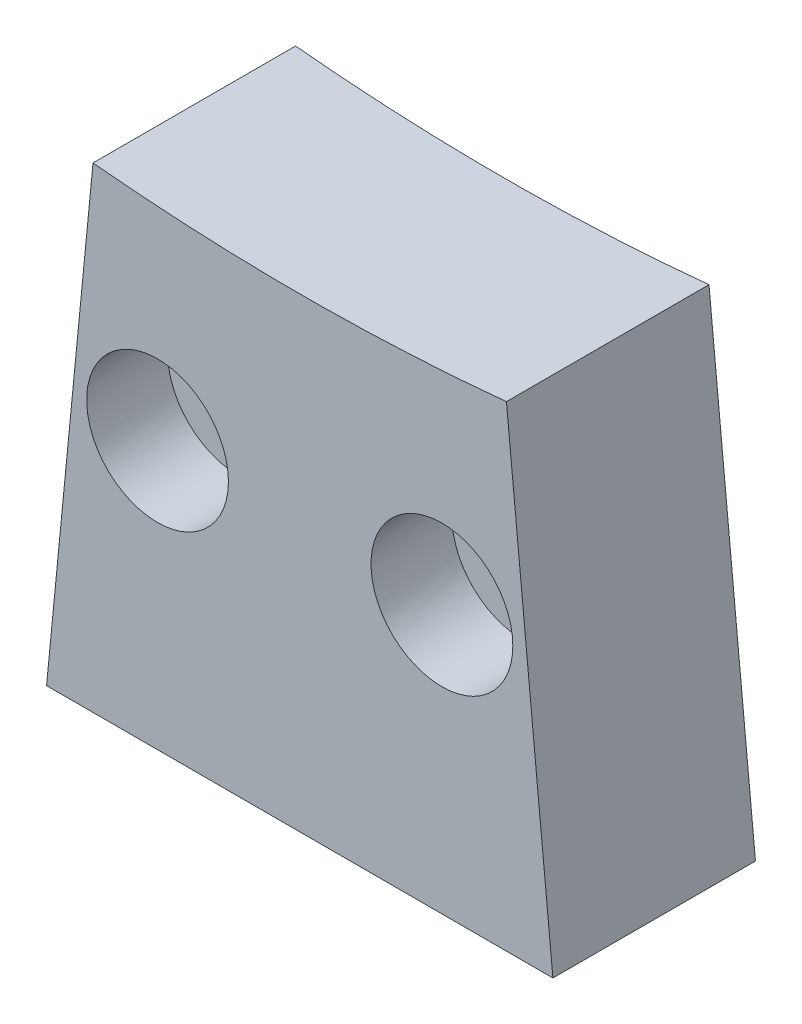
ISO-10303-21;
HEADER;
FILE_DESCRIPTION(('STEP AP214'),'2;1');
FILE_NAME('part.step','',(''),(''),'','','');
FILE_SCHEMA(('AUTOMOTIVE_DESIGN { 1 0 10303 214 1 1 1 1 }'));
ENDSEC;
DATA;
#1=APPLICATION_CONTEXT('core data for automotive mechanical design processes');
#2=APPLICATION_PROTOCOL_DEFINITION('international standard','automotive_design',2000,#1);
#3=PRODUCT_CONTEXT('',#1,'mechanical');
#4=PRODUCT('Part','Part','',(#3));
#5=PRODUCT_RELATED_PRODUCT_CATEGORY('part','',(#4));
#6=PRODUCT_DEFINITION_FORMATION('','',#4);
#7=PRODUCT_DEFINITION_CONTEXT('part definition',#1,'design');
#8=PRODUCT_DEFINITION('design','',#6,#7);
#9=PRODUCT_DEFINITION_SHAPE('','',#8);
#10=(LENGTH_UNIT() NAMED_UNIT(*) SI_UNIT(.MILLI.,.METRE.));
#11=(NAMED_UNIT(*) PLANE_ANGLE_UNIT() SI_UNIT($,.RADIAN.));
#12=(NAMED_UNIT(*) SI_UNIT($,.STERADIAN.) SOLID_ANGLE_UNIT());
#13=UNCERTAINTY_MEASURE_WITH_UNIT(LENGTH_MEASURE(1.E-05),#10,'distance_accuracy_value','');
#14=(GEOMETRIC_REPRESENTATION_CONTEXT(3) GLOBAL_UNCERTAINTY_ASSIGNED_CONTEXT((#13)) GLOBAL_UNIT_ASSIGNED_CONTEXT((#10,
#11,#12)) REPRESENTATION_CONTEXT('',''));
#15=CARTESIAN_POINT('',(0.,0.,0.));
#16=DIRECTION('',(0.,0.,1.));
#17=DIRECTION('',(1.,0.,0.));
#18=AXIS2_PLACEMENT_3D('',#15,#16,#17);
#19=CARTESIAN_POINT('',(7.02058204650813,-114.785501818515,-0.000999999999999265));
#20=DIRECTION('',(0.,0.,1.));
#21=DIRECTION('',(1.,0.,0.));
#22=AXIS2_PLACEMENT_3D('',#19,#20,#21);
#23=CYLINDRICAL_SURFACE('',#22,1.75);
#24=CARTESIAN_POINT('',(7.02058204650813,-114.785501818515,0.));
#25=DIRECTION('',(0.,0.,-1.));
#26=DIRECTION('',(-1.,0.,0.));
#27=AXIS2_PLACEMENT_3D('',#24,#25,#26);
#28=CIRCLE('',#27,1.75);
#29=CARTESIAN_POINT('',(5.27058204650813,-114.785501818515,0.));
#30=VERTEX_POINT('',#29);
#31=EDGE_CURVE('E147',#30,#30,#28,.F.);
#32=ORIENTED_EDGE('',*,*,#31,.F.);
#33=EDGE_LOOP('',(#32));
#34=FACE_BOUND('',#33,.T.);
#35=CARTESIAN_POINT('',(7.02058204650813,-114.785501818515,6.));
#36=DIRECTION('',(0.,0.,1.));
#37=DIRECTION('',(1.,0.,0.));
#38=AXIS2_PLACEMENT_3D('',#35,#36,#37);
#39=CIRCLE('',#38,1.75);
#40=CARTESIAN_POINT('',(8.77058204650814,-114.785501818515,6.));
#41=VERTEX_POINT('',#40);
#42=EDGE_CURVE('E166',#41,#41,#39,.F.);
#43=ORIENTED_EDGE('',*,*,#42,.F.);
#44=EDGE_LOOP('',(#43));
#45=FACE_BOUND('',#44,.T.);
#46=ADVANCED_FACE('F39',(#34,#45),#23,.F.);
#47=CARTESIAN_POINT('',(-7.02058204650813,-114.785501818515,-0.000999999999999265));
#48=DIRECTION('',(0.,0.,1.));
#49=DIRECTION('',(1.,0.,0.));
#50=AXIS2_PLACEMENT_3D('',#47,#48,#49);
#51=CYLINDRICAL_SURFACE('',#50,1.75);
#52=CARTESIAN_POINT('',(-7.02058204650813,-114.785501818515,0.));
#53=DIRECTION('',(0.,0.,-1.));
#54=DIRECTION('',(-1.,0.,0.));
#55=AXIS2_PLACEMENT_3D('',#52,#53,#54);
#56=CIRCLE('',#55,1.75);
#57=CARTESIAN_POINT('',(-8.77058204650813,-114.785501818515,0.));
#58=VERTEX_POINT('',#57);
#59=EDGE_CURVE('E136',#58,#58,#56,.F.);
#60=ORIENTED_EDGE('',*,*,#59,.F.);
#61=EDGE_LOOP('',(#60));
#62=FACE_BOUND('',#61,.T.);
#63=CARTESIAN_POINT('',(-7.02058204650813,-114.785501818515,6.));
#64=DIRECTION('',(0.,0.,1.));
#65=DIRECTION('',(1.,0.,0.));
#66=AXIS2_PLACEMENT_3D('',#63,#64,#65);
#67=CIRCLE('',#66,1.75);
#68=CARTESIAN_POINT('',(-5.27058204650813,-114.785501818515,6.));
#69=VERTEX_POINT('',#68);
#70=EDGE_CURVE('E43',#69,#69,#67,.F.);
#71=ORIENTED_EDGE('',*,*,#70,.F.);
#72=EDGE_LOOP('',(#71));
#73=FACE_BOUND('',#72,.T.);
#74=ADVANCED_FACE('F179',(#62,#73),#51,.F.);
#75=CARTESIAN_POINT('',(0.,0.,10.));
#76=DIRECTION('',(0.,0.,-1.));
#77=DIRECTION('',(-1.,0.,0.));
#78=AXIS2_PLACEMENT_3D('',#75,#76,#77);
#79=CYLINDRICAL_SURFACE('',#78,105.);
#80=CARTESIAN_POINT('',(0.,0.,0.));
#81=DIRECTION('',(0.,0.,-1.));
#82=DIRECTION('',(-1.,0.,0.));
#83=AXIS2_PLACEMENT_3D('',#80,#81,#82);
#84=CIRCLE('',#83,105.);
#85=CARTESIAN_POINT('',(10.2053587787538,-104.502873894438,0.));
#86=VERTEX_POINT('',#85);
#87=CARTESIAN_POINT('',(-10.2053587787537,-104.502873894438,0.));
#88=VERTEX_POINT('',#87);
#89=EDGE_CURVE('E110',#86,#88,#84,.T.);
#90=ORIENTED_EDGE('',*,*,#89,.T.);
#91=DIRECTION('',(0.,0.,-1.));
#92=VECTOR('',#91,1.);
#93=CARTESIAN_POINT('',(-10.2053587787537,-104.502873894438,10.));
#94=LINE('',#93,#92);
#95=CARTESIAN_POINT('',(-10.2053587787537,-104.502873894438,10.));
#96=VERTEX_POINT('',#95);
#97=EDGE_CURVE('E11',#96,#88,#94,.T.);
#98=ORIENTED_EDGE('',*,*,#97,.F.);
#99=CARTESIAN_POINT('',(0.,0.,10.));
#100=DIRECTION('',(0.,0.,-1.));
#101=DIRECTION('',(-1.,0.,0.));
#102=AXIS2_PLACEMENT_3D('',#99,#100,#101);
#103=CIRCLE('',#102,105.);
#104=CARTESIAN_POINT('',(10.2053587787538,-104.502873894438,10.));
#105=VERTEX_POINT('',#104);
#106=EDGE_CURVE('E93',#105,#96,#103,.T.);
#107=ORIENTED_EDGE('',*,*,#106,.F.);
#108=DIRECTION('',(0.,0.,-1.));
#109=VECTOR('',#108,1.);
#110=CARTESIAN_POINT('',(10.2053587787538,-104.502873894438,10.));
#111=LINE('',#110,#109);
#112=EDGE_CURVE('E106',#105,#86,#111,.T.);
#113=ORIENTED_EDGE('',*,*,#112,.T.);
#114=EDGE_LOOP('',(#90,#98,#107,#113));
#115=FACE_BOUND('',#114,.T.);
#116=ADVANCED_FACE('F41',(#115),#79,.F.);
#117=CARTESIAN_POINT('',(-10.2053587787537,-104.502873894438,10.));
#118=DIRECTION('',(0.995265465661319,-0.0971938931309879,0.));
#119=DIRECTION('',(0.0971938931309879,0.995265465661319,0.));
#120=AXIS2_PLACEMENT_3D('',#117,#118,#119);
#121=PLANE('',#120);
#122=DIRECTION('',(-0.0971938931309879,-0.995265465661319,0.));
#123=VECTOR('',#122,1.);
#124=CARTESIAN_POINT('',(-10.2053587787537,-104.502873894438,0.));
#125=LINE('',#124,#123);
#126=CARTESIAN_POINT('',(-12.5,-128.,0.));
#127=VERTEX_POINT('',#126);
#128=EDGE_CURVE('E98',#88,#127,#125,.T.);
#129=ORIENTED_EDGE('',*,*,#128,.T.);
#130=DIRECTION('',(0.,0.,-1.));
#131=VECTOR('',#130,1.);
#132=CARTESIAN_POINT('',(-12.5,-128.,10.));
#133=LINE('',#132,#131);
#134=CARTESIAN_POINT('',(-12.5,-128.,10.));
#135=VERTEX_POINT('',#134);
#136=EDGE_CURVE('E50',#135,#127,#133,.T.);
#137=ORIENTED_EDGE('',*,*,#136,.F.);
#138=DIRECTION('',(-0.0971938931309879,-0.995265465661319,0.));
#139=VECTOR('',#138,1.);
#140=CARTESIAN_POINT('',(-10.2053587787537,-104.502873894438,10.));
#141=LINE('',#140,#139);
#142=EDGE_CURVE('E88',#96,#135,#141,.T.);
#143=ORIENTED_EDGE('',*,*,#142,.F.);
#144=ORIENTED_EDGE('',*,*,#97,.T.);
#145=EDGE_LOOP('',(#129,#137,#143,#144));
#146=FACE_BOUND('',#145,.T.);
#147=ADVANCED_FACE('F97',(#146),#121,.F.);
#148=CARTESIAN_POINT('',(-12.5,-128.,10.));
#149=DIRECTION('',(0.,1.,0.));
#150=DIRECTION('',(0.,0.,1.));
#151=AXIS2_PLACEMENT_3D('',#148,#149,#150);
#152=PLANE('',#151);
#153=CARTESIAN_POINT('',(-4.75,-128.,6.));
#154=DIRECTION('',(0.,-1.,0.));
#155=DIRECTION('',(1.,0.,0.));
#156=AXIS2_PLACEMENT_3D('',#153,#154,#155);
#157=CIRCLE('',#156,1.025);
#158=CARTESIAN_POINT('',(-3.725,-128.,6.));
#159=VERTEX_POINT('',#158);
#160=EDGE_CURVE('E140',#159,#159,#157,.T.);
#161=ORIENTED_EDGE('',*,*,#160,.F.);
#162=EDGE_LOOP('',(#161));
#163=FACE_BOUND('',#162,.T.);
#164=CARTESIAN_POINT('',(4.75,-128.,6.));
#165=DIRECTION('',(0.,-1.,0.));
#166=DIRECTION('',(1.,0.,0.));
#167=AXIS2_PLACEMENT_3D('',#164,#165,#166);
#168=CIRCLE('',#167,1.025);
#169=CARTESIAN_POINT('',(5.775,-128.,6.));
#170=VERTEX_POINT('',#169);
#171=EDGE_CURVE('E131',#170,#170,#168,.T.);
#172=ORIENTED_EDGE('',*,*,#171,.F.);
#173=EDGE_LOOP('',(#172));
#174=FACE_BOUND('',#173,.T.);
#175=DIRECTION('',(1.,0.,0.));
#176=VECTOR('',#175,1.);
#177=CARTESIAN_POINT('',(-12.5,-128.,0.));
#178=LINE('',#177,#176);
#179=CARTESIAN_POINT('',(12.5,-128.,0.));
#180=VERTEX_POINT('',#179);
#181=EDGE_CURVE('E75',#127,#180,#178,.T.);
#182=ORIENTED_EDGE('',*,*,#181,.T.);
#183=DIRECTION('',(0.,0.,-1.));
#184=VECTOR('',#183,1.);
#185=CARTESIAN_POINT('',(12.5,-128.,10.));
#186=LINE('',#185,#184);
#187=CARTESIAN_POINT('',(12.5,-128.,10.));
#188=VERTEX_POINT('',#187);
#189=EDGE_CURVE('E100',#188,#180,#186,.T.);
#190=ORIENTED_EDGE('',*,*,#189,.F.);
#191=DIRECTION('',(1.,0.,0.));
#192=VECTOR('',#191,1.);
#193=CARTESIAN_POINT('',(-12.5,-128.,10.));
#194=LINE('',#193,#192);
#195=EDGE_CURVE('E91',#135,#188,#194,.T.);
#196=ORIENTED_EDGE('',*,*,#195,.F.);
#197=ORIENTED_EDGE('',*,*,#136,.T.);
#198=EDGE_LOOP('',(#182,#190,#196,#197));
#199=FACE_BOUND('',#198,.T.);
#200=ADVANCED_FACE('F102',(#163,#174,#199),#152,.F.);
#201=CARTESIAN_POINT('',(10.2053587787538,-104.502873894438,10.));
#202=DIRECTION('',(-0.995265465661319,-0.0971938931309882,0.));
#203=DIRECTION('',(0.0971938931309882,-0.995265465661319,0.));
#204=AXIS2_PLACEMENT_3D('',#201,#202,#203);
#205=PLANE('',#204);
#206=DIRECTION('',(-0.0971938931309882,0.995265465661319,0.));
#207=VECTOR('',#206,1.);
#208=CARTESIAN_POINT('',(10.2053587787538,-104.502873894438,0.));
#209=LINE('',#208,#207);
#210=EDGE_CURVE('E81',#180,#86,#209,.T.);
#211=ORIENTED_EDGE('',*,*,#210,.T.);
#212=ORIENTED_EDGE('',*,*,#112,.F.);
#213=DIRECTION('',(-0.0971938931309882,0.995265465661319,0.));
#214=VECTOR('',#213,1.);
#215=CARTESIAN_POINT('',(10.2053587787538,-104.502873894438,10.));
#216=LINE('',#215,#214);
#217=EDGE_CURVE('E58',#188,#105,#216,.T.);
#218=ORIENTED_EDGE('',*,*,#217,.F.);
#219=ORIENTED_EDGE('',*,*,#189,.T.);
#220=EDGE_LOOP('',(#211,#212,#218,#219));
#221=FACE_BOUND('',#220,.T.);
#222=ADVANCED_FACE('F124',(#221),#205,.F.);
#223=CARTESIAN_POINT('',(0.,0.,10.));
#224=DIRECTION('',(0.,0.,-1.));
#225=DIRECTION('',(-1.,0.,0.));
#226=AXIS2_PLACEMENT_3D('',#223,#224,#225);
#227=PLANE('',#226);
#228=CARTESIAN_POINT('',(7.02058204650813,-114.785501818515,10.));
#229=DIRECTION('',(0.,0.,1.));
#230=DIRECTION('',(1.,0.,0.));
#231=AXIS2_PLACEMENT_3D('',#228,#229,#230);
#232=CIRCLE('',#231,3.5);
#233=CARTESIAN_POINT('',(10.5205820465081,-114.785501818515,10.));
#234=VERTEX_POINT('',#233);
#235=EDGE_CURVE('E162',#234,#234,#232,.T.);
#236=ORIENTED_EDGE('',*,*,#235,.F.);
#237=EDGE_LOOP('',(#236));
#238=FACE_BOUND('',#237,.T.);
#239=CARTESIAN_POINT('',(-7.02058204650813,-114.785501818515,10.));
#240=DIRECTION('',(0.,0.,1.));
#241=DIRECTION('',(1.,0.,0.));
#242=AXIS2_PLACEMENT_3D('',#239,#240,#241);
#243=CIRCLE('',#242,3.5);
#244=CARTESIAN_POINT('',(-3.52058204650813,-114.785501818515,10.));
#245=VERTEX_POINT('',#244);
#246=EDGE_CURVE('E158',#245,#245,#243,.T.);
#247=ORIENTED_EDGE('',*,*,#246,.F.);
#248=EDGE_LOOP('',(#247));
#249=FACE_BOUND('',#248,.T.);
#250=ORIENTED_EDGE('',*,*,#106,.T.);
#251=ORIENTED_EDGE('',*,*,#142,.T.);
#252=ORIENTED_EDGE('',*,*,#195,.T.);
#253=ORIENTED_EDGE('',*,*,#217,.T.);
#254=EDGE_LOOP('',(#250,#251,#252,#253));
#255=FACE_BOUND('',#254,.T.);
#256=ADVANCED_FACE('F89',(#238,#249,#255),#227,.F.);
#257=CARTESIAN_POINT('',(0.,0.,0.));
#258=DIRECTION('',(0.,0.,-1.));
#259=DIRECTION('',(-1.,0.,0.));
#260=AXIS2_PLACEMENT_3D('',#257,#258,#259);
#261=PLANE('',#260);
#262=ORIENTED_EDGE('',*,*,#59,.T.);
#263=EDGE_LOOP('',(#262));
#264=FACE_BOUND('',#263,.T.);
#265=ORIENTED_EDGE('',*,*,#31,.T.);
#266=EDGE_LOOP('',(#265));
#267=FACE_BOUND('',#266,.T.);
#268=ORIENTED_EDGE('',*,*,#89,.F.);
#269=ORIENTED_EDGE('',*,*,#210,.F.);
#270=ORIENTED_EDGE('',*,*,#181,.F.);
#271=ORIENTED_EDGE('',*,*,#128,.F.);
#272=EDGE_LOOP('',(#268,#269,#270,#271));
#273=FACE_BOUND('',#272,.T.);
#274=ADVANCED_FACE('F127',(#264,#267,#273),#261,.T.);
#275=CARTESIAN_POINT('',(4.75,-120.,6.));
#276=DIRECTION('',(0.,-1.,0.));
#277=DIRECTION('',(1.,0.,0.));
#278=AXIS2_PLACEMENT_3D('',#275,#276,#277);
#279=CYLINDRICAL_SURFACE('',#278,1.025);
#280=CARTESIAN_POINT('',(4.75,-120.,6.));
#281=DIRECTION('',(0.,-1.,0.));
#282=DIRECTION('',(1.,0.,0.));
#283=AXIS2_PLACEMENT_3D('',#280,#281,#282);
#284=CIRCLE('',#283,1.025);
#285=CARTESIAN_POINT('',(5.775,-120.,6.));
#286=VERTEX_POINT('',#285);
#287=EDGE_CURVE('E135',#286,#286,#284,.T.);
#288=ORIENTED_EDGE('',*,*,#287,.F.);
#289=EDGE_LOOP('',(#288));
#290=FACE_BOUND('',#289,.T.);
#291=ORIENTED_EDGE('',*,*,#171,.T.);
#292=EDGE_LOOP('',(#291));
#293=FACE_BOUND('',#292,.T.);
#294=ADVANCED_FACE('F202',(#290,#293),#279,.F.);
#295=CARTESIAN_POINT('',(4.75,-120.,6.));
#296=DIRECTION('',(0.,-1.,0.));
#297=DIRECTION('',(1.,0.,0.));
#298=AXIS2_PLACEMENT_3D('',#295,#296,#297);
#299=PLANE('',#298);
#300=ORIENTED_EDGE('',*,*,#287,.T.);
#301=EDGE_LOOP('',(#300));
#302=FACE_BOUND('',#301,.T.);
#303=ADVANCED_FACE('F198',(#302),#299,.T.);
#304=CARTESIAN_POINT('',(-4.75,-120.,6.));
#305=DIRECTION('',(0.,-1.,0.));
#306=DIRECTION('',(1.,0.,0.));
#307=AXIS2_PLACEMENT_3D('',#304,#305,#306);
#308=CYLINDRICAL_SURFACE('',#307,1.025);
#309=CARTESIAN_POINT('',(-4.75,-120.,6.));
#310=DIRECTION('',(0.,-1.,0.));
#311=DIRECTION('',(1.,0.,0.));
#312=AXIS2_PLACEMENT_3D('',#309,#310,#311);
#313=CIRCLE('',#312,1.025);
#314=CARTESIAN_POINT('',(-3.725,-120.,6.));
#315=VERTEX_POINT('',#314);
#316=EDGE_CURVE('E114',#315,#315,#313,.T.);
#317=ORIENTED_EDGE('',*,*,#316,.F.);
#318=EDGE_LOOP('',(#317));
#319=FACE_BOUND('',#318,.T.);
#320=ORIENTED_EDGE('',*,*,#160,.T.);
#321=EDGE_LOOP('',(#320));
#322=FACE_BOUND('',#321,.T.);
#323=ADVANCED_FACE('F194',(#319,#322),#308,.F.);
#324=CARTESIAN_POINT('',(-4.75,-120.,6.));
#325=DIRECTION('',(0.,-1.,0.));
#326=DIRECTION('',(1.,0.,0.));
#327=AXIS2_PLACEMENT_3D('',#324,#325,#326);
#328=PLANE('',#327);
#329=ORIENTED_EDGE('',*,*,#316,.T.);
#330=EDGE_LOOP('',(#329));
#331=FACE_BOUND('',#330,.T.);
#332=ADVANCED_FACE('F190',(#331),#328,.T.);
#333=CARTESIAN_POINT('',(-7.02058204650813,-114.785501818515,6.));
#334=DIRECTION('',(0.,0.,1.));
#335=DIRECTION('',(1.,0.,0.));
#336=AXIS2_PLACEMENT_3D('',#333,#334,#335);
#337=PLANE('',#336);
#338=CARTESIAN_POINT('',(-7.02058204650813,-114.785501818515,6.));
#339=DIRECTION('',(0.,0.,1.));
#340=DIRECTION('',(1.,0.,0.));
#341=AXIS2_PLACEMENT_3D('',#338,#339,#340);
#342=CIRCLE('',#341,3.5);
#343=CARTESIAN_POINT('',(-3.52058204650813,-114.785501818515,6.));
#344=VERTEX_POINT('',#343);
#345=EDGE_CURVE('E154',#344,#344,#342,.T.);
#346=ORIENTED_EDGE('',*,*,#345,.T.);
#347=EDGE_LOOP('',(#346));
#348=FACE_BOUND('',#347,.T.);
#349=ORIENTED_EDGE('',*,*,#70,.T.);
#350=EDGE_LOOP('',(#349));
#351=FACE_BOUND('',#350,.T.);
#352=ADVANCED_FACE('F193',(#348,#351),#337,.T.);
#353=CARTESIAN_POINT('',(-7.02058204650813,-114.785501818515,6.));
#354=DIRECTION('',(0.,0.,1.));
#355=DIRECTION('',(1.,0.,0.));
#356=AXIS2_PLACEMENT_3D('',#353,#354,#355);
#357=CYLINDRICAL_SURFACE('',#356,3.5);
#358=ORIENTED_EDGE('',*,*,#345,.F.);
#359=EDGE_LOOP('',(#358));
#360=FACE_BOUND('',#359,.T.);
#361=ORIENTED_EDGE('',*,*,#246,.T.);
#362=EDGE_LOOP('',(#361));
#363=FACE_BOUND('',#362,.T.);
#364=ADVANCED_FACE('F248',(#360,#363),#357,.F.);
#365=CARTESIAN_POINT('',(7.02058204650813,-114.785501818515,6.));
#366=DIRECTION('',(0.,0.,1.));
#367=DIRECTION('',(1.,0.,0.));
#368=AXIS2_PLACEMENT_3D('',#365,#366,#367);
#369=CYLINDRICAL_SURFACE('',#368,3.5);
#370=CARTESIAN_POINT('',(7.02058204650813,-114.785501818515,6.));
#371=DIRECTION('',(0.,0.,1.));
#372=DIRECTION('',(1.,0.,0.));
#373=AXIS2_PLACEMENT_3D('',#370,#371,#372);
#374=CIRCLE('',#373,3.5);
#375=CARTESIAN_POINT('',(10.5205820465081,-114.785501818515,6.));
#376=VERTEX_POINT('',#375);
#377=EDGE_CURVE('E167',#376,#376,#374,.T.);
#378=ORIENTED_EDGE('',*,*,#377,.F.);
#379=EDGE_LOOP('',(#378));
#380=FACE_BOUND('',#379,.T.);
#381=ORIENTED_EDGE('',*,*,#235,.T.);
#382=EDGE_LOOP('',(#381));
#383=FACE_BOUND('',#382,.T.);
#384=ADVANCED_FACE('F257',(#380,#383),#369,.F.);
#385=CARTESIAN_POINT('',(0.,0.,6.));
#386=DIRECTION('',(0.,0.,1.));
#387=DIRECTION('',(1.,0.,0.));
#388=AXIS2_PLACEMENT_3D('',#385,#386,#387);
#389=PLANE('',#388);
#390=ORIENTED_EDGE('',*,*,#42,.T.);
#391=EDGE_LOOP('',(#390));
#392=FACE_BOUND('',#391,.T.);
#393=ORIENTED_EDGE('',*,*,#377,.T.);
#394=EDGE_LOOP('',(#393));
#395=FACE_BOUND('',#394,.T.);
#396=ADVANCED_FACE('F175',(#392,#395),#389,.T.);
#397=CLOSED_SHELL('',(#46,#74,#116,#147,#200,#222,#256,#274,#294,#303,#323,#332,#352,#364,#384,#396));
#398=MANIFOLD_SOLID_BREP('B2',#397);
#399=ADVANCED_BREP_SHAPE_REPRESENTATION('',(#18,#398),#14);
#400=SHAPE_DEFINITION_REPRESENTATION(#9,#399);
ENDSEC;
END-ISO-10303-21;
